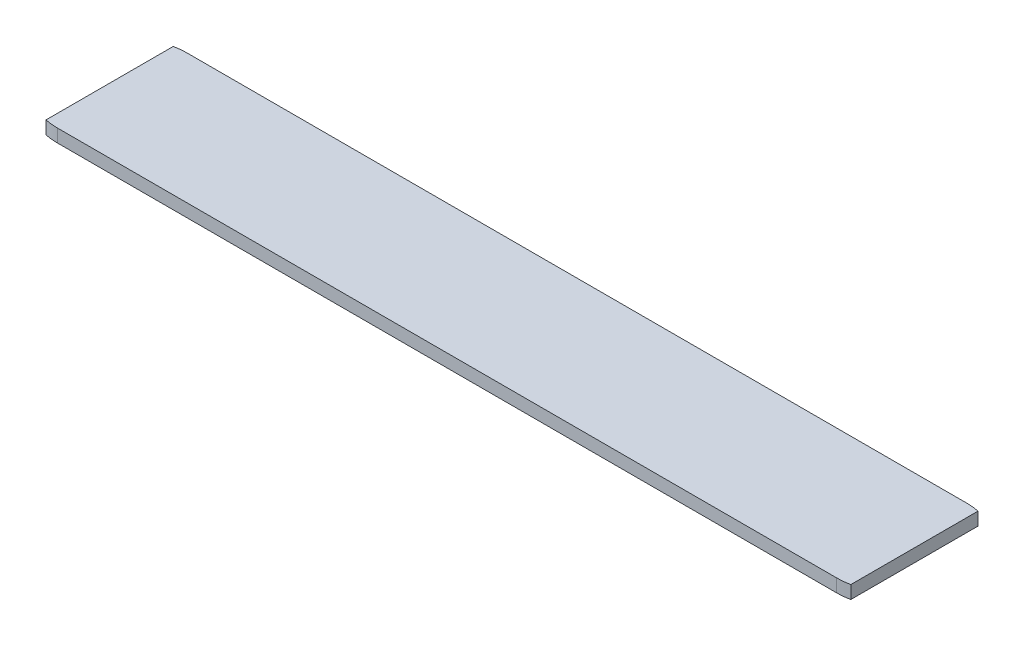
ISO-10303-21;
HEADER;
FILE_DESCRIPTION(('STEP AP214'),'2;1');
FILE_NAME('part.step','',(''),(''),'','','');
FILE_SCHEMA(('AUTOMOTIVE_DESIGN { 1 0 10303 214 1 1 1 1 }'));
ENDSEC;
DATA;
#1=APPLICATION_CONTEXT('core data for automotive mechanical design processes');
#2=APPLICATION_PROTOCOL_DEFINITION('international standard','automotive_design',2000,#1);
#3=PRODUCT_CONTEXT('',#1,'mechanical');
#4=PRODUCT('Part','Part','',(#3));
#5=PRODUCT_RELATED_PRODUCT_CATEGORY('part','',(#4));
#6=PRODUCT_DEFINITION_FORMATION('','',#4);
#7=PRODUCT_DEFINITION_CONTEXT('part definition',#1,'design');
#8=PRODUCT_DEFINITION('design','',#6,#7);
#9=PRODUCT_DEFINITION_SHAPE('','',#8);
#10=(LENGTH_UNIT() NAMED_UNIT(*) SI_UNIT(.MILLI.,.METRE.));
#11=(NAMED_UNIT(*) PLANE_ANGLE_UNIT() SI_UNIT($,.RADIAN.));
#12=(NAMED_UNIT(*) SI_UNIT($,.STERADIAN.) SOLID_ANGLE_UNIT());
#13=UNCERTAINTY_MEASURE_WITH_UNIT(LENGTH_MEASURE(1.E-05),#10,'distance_accuracy_value','');
#14=(GEOMETRIC_REPRESENTATION_CONTEXT(3) GLOBAL_UNCERTAINTY_ASSIGNED_CONTEXT((#13)) GLOBAL_UNIT_ASSIGNED_CONTEXT((#10,
#11,#12)) REPRESENTATION_CONTEXT('',''));
#15=CARTESIAN_POINT('',(0.,0.,0.));
#16=DIRECTION('',(0.,0.,1.));
#17=DIRECTION('',(1.,0.,0.));
#18=AXIS2_PLACEMENT_3D('',#15,#16,#17);
#19=CARTESIAN_POINT('',(-47.625,1.58750000000002,0.));
#20=DIRECTION('',(0.,-1.,0.));
#21=DIRECTION('',(0.,0.,-1.));
#22=AXIS2_PLACEMENT_3D('',#19,#20,#21);
#23=CYLINDRICAL_SURFACE('',#22,7.9375);
#24=DIRECTION('',(0.,-1.,0.));
#25=VECTOR('',#24,1.);
#26=CARTESIAN_POINT('',(-49.2125,1.58750000000002,-7.7771299333366));
#27=LINE('',#26,#25);
#28=CARTESIAN_POINT('',(-49.2125,1.58750000000002,-7.7771299333366));
#29=VERTEX_POINT('',#28);
#30=CARTESIAN_POINT('',(-49.2125,0.,-7.7771299333366));
#31=VERTEX_POINT('',#30);
#32=EDGE_CURVE('E61',#29,#31,#27,.T.);
#33=ORIENTED_EDGE('',*,*,#32,.F.);
#34=CARTESIAN_POINT('',(-47.625,1.58750000000002,0.));
#35=DIRECTION('',(0.,1.,0.));
#36=DIRECTION('',(0.,0.,1.));
#37=AXIS2_PLACEMENT_3D('',#34,#35,#36);
#38=CIRCLE('',#37,7.9375);
#39=CARTESIAN_POINT('',(-47.625,1.58750000000002,-7.93750000000001));
#40=VERTEX_POINT('',#39);
#41=EDGE_CURVE('E168',#40,#29,#38,.T.);
#42=ORIENTED_EDGE('',*,*,#41,.F.);
#43=DIRECTION('',(0.,-1.,0.));
#44=VECTOR('',#43,1.);
#45=CARTESIAN_POINT('',(-47.625,1.58750000000002,-7.93750000000001));
#46=LINE('',#45,#44);
#47=CARTESIAN_POINT('',(-47.625,0.,-7.93750000000001));
#48=VERTEX_POINT('',#47);
#49=EDGE_CURVE('E128',#40,#48,#46,.T.);
#50=ORIENTED_EDGE('',*,*,#49,.T.);
#51=CARTESIAN_POINT('',(-47.625,0.,0.));
#52=DIRECTION('',(0.,1.,0.));
#53=DIRECTION('',(0.,0.,1.));
#54=AXIS2_PLACEMENT_3D('',#51,#52,#53);
#55=CIRCLE('',#54,7.9375);
#56=EDGE_CURVE('E133',#48,#31,#55,.T.);
#57=ORIENTED_EDGE('',*,*,#56,.T.);
#58=EDGE_LOOP('',(#33,#42,#50,#57));
#59=FACE_BOUND('',#58,.T.);
#60=ADVANCED_FACE('F40',(#59),#23,.T.);
#61=DIRECTION('',(0.,-1.,0.));
#62=VECTOR('',#61,1.);
#63=CARTESIAN_POINT('',(-49.2125,1.58750000000002,7.7771299333366));
#64=LINE('',#63,#62);
#65=CARTESIAN_POINT('',(-49.2125,0.,7.7771299333366));
#66=VERTEX_POINT('',#65);
#67=CARTESIAN_POINT('',(-49.2125,1.58750000000002,7.7771299333366));
#68=VERTEX_POINT('',#67);
#69=EDGE_CURVE('E118',#66,#68,#64,.F.);
#70=ORIENTED_EDGE('',*,*,#69,.F.);
#71=CARTESIAN_POINT('',(-47.625,0.,7.93750000000001));
#72=VERTEX_POINT('',#71);
#73=EDGE_CURVE('E137',#66,#72,#55,.T.);
#74=ORIENTED_EDGE('',*,*,#73,.T.);
#75=DIRECTION('',(0.,-1.,0.));
#76=VECTOR('',#75,1.);
#77=CARTESIAN_POINT('',(-47.625,1.58750000000002,7.93750000000001));
#78=LINE('',#77,#76);
#79=CARTESIAN_POINT('',(-47.625,1.58750000000002,7.93750000000001));
#80=VERTEX_POINT('',#79);
#81=EDGE_CURVE('E151',#80,#72,#78,.T.);
#82=ORIENTED_EDGE('',*,*,#81,.F.);
#83=EDGE_CURVE('E143',#68,#80,#38,.T.);
#84=ORIENTED_EDGE('',*,*,#83,.F.);
#85=EDGE_LOOP('',(#70,#74,#82,#84));
#86=FACE_BOUND('',#85,.T.);
#87=ADVANCED_FACE('F177',(#86),#23,.T.);
#88=CARTESIAN_POINT('',(47.625,1.58750000000002,0.));
#89=DIRECTION('',(0.,-1.,0.));
#90=DIRECTION('',(0.,0.,-1.));
#91=AXIS2_PLACEMENT_3D('',#88,#89,#90);
#92=CYLINDRICAL_SURFACE('',#91,7.9375);
#93=DIRECTION('',(0.,-1.,0.));
#94=VECTOR('',#93,1.);
#95=CARTESIAN_POINT('',(49.2125,1.58750000000002,7.7771299333366));
#96=LINE('',#95,#94);
#97=CARTESIAN_POINT('',(49.2125,1.58750000000002,7.7771299333366));
#98=VERTEX_POINT('',#97);
#99=CARTESIAN_POINT('',(49.2125,0.,7.7771299333366));
#100=VERTEX_POINT('',#99);
#101=EDGE_CURVE('E54',#98,#100,#96,.T.);
#102=ORIENTED_EDGE('',*,*,#101,.F.);
#103=CARTESIAN_POINT('',(47.625,1.58750000000002,0.));
#104=DIRECTION('',(0.,1.,0.));
#105=DIRECTION('',(0.,0.,1.));
#106=AXIS2_PLACEMENT_3D('',#103,#104,#105);
#107=CIRCLE('',#106,7.9375);
#108=CARTESIAN_POINT('',(47.625,1.58750000000002,7.93750000000001));
#109=VERTEX_POINT('',#108);
#110=EDGE_CURVE('E115',#109,#98,#107,.T.);
#111=ORIENTED_EDGE('',*,*,#110,.F.);
#112=DIRECTION('',(0.,-1.,0.));
#113=VECTOR('',#112,1.);
#114=CARTESIAN_POINT('',(47.625,1.58750000000002,7.93750000000001));
#115=LINE('',#114,#113);
#116=CARTESIAN_POINT('',(47.625,0.,7.93750000000001));
#117=VERTEX_POINT('',#116);
#118=EDGE_CURVE('E149',#109,#117,#115,.T.);
#119=ORIENTED_EDGE('',*,*,#118,.T.);
#120=CARTESIAN_POINT('',(47.625,0.,0.));
#121=DIRECTION('',(0.,1.,0.));
#122=DIRECTION('',(0.,0.,1.));
#123=AXIS2_PLACEMENT_3D('',#120,#121,#122);
#124=CIRCLE('',#123,7.9375);
#125=EDGE_CURVE('E117',#117,#100,#124,.T.);
#126=ORIENTED_EDGE('',*,*,#125,.T.);
#127=EDGE_LOOP('',(#102,#111,#119,#126));
#128=FACE_BOUND('',#127,.T.);
#129=ADVANCED_FACE('F113',(#128),#92,.T.);
#130=DIRECTION('',(0.,-1.,0.));
#131=VECTOR('',#130,1.);
#132=CARTESIAN_POINT('',(49.2125,1.58750000000002,-7.7771299333366));
#133=LINE('',#132,#131);
#134=CARTESIAN_POINT('',(49.2125,0.,-7.7771299333366));
#135=VERTEX_POINT('',#134);
#136=CARTESIAN_POINT('',(49.2125,1.58750000000002,-7.7771299333366));
#137=VERTEX_POINT('',#136);
#138=EDGE_CURVE('E104',#135,#137,#133,.F.);
#139=ORIENTED_EDGE('',*,*,#138,.F.);
#140=CARTESIAN_POINT('',(47.625,0.,-7.93750000000001));
#141=VERTEX_POINT('',#140);
#142=EDGE_CURVE('E139',#135,#141,#124,.T.);
#143=ORIENTED_EDGE('',*,*,#142,.T.);
#144=DIRECTION('',(0.,-1.,0.));
#145=VECTOR('',#144,1.);
#146=CARTESIAN_POINT('',(47.625,1.58750000000002,-7.93750000000001));
#147=LINE('',#146,#145);
#148=CARTESIAN_POINT('',(47.625,1.58750000000002,-7.93750000000001));
#149=VERTEX_POINT('',#148);
#150=EDGE_CURVE('E146',#149,#141,#147,.T.);
#151=ORIENTED_EDGE('',*,*,#150,.F.);
#152=EDGE_CURVE('E126',#137,#149,#107,.T.);
#153=ORIENTED_EDGE('',*,*,#152,.F.);
#154=EDGE_LOOP('',(#139,#143,#151,#153));
#155=FACE_BOUND('',#154,.T.);
#156=ADVANCED_FACE('F156',(#155),#92,.T.);
#157=CARTESIAN_POINT('',(-47.625,1.58750000000002,0.));
#158=DIRECTION('',(0.,1.,0.));
#159=DIRECTION('',(0.,0.,1.));
#160=AXIS2_PLACEMENT_3D('',#157,#158,#159);
#161=PLANE('',#160);
#162=ORIENTED_EDGE('',*,*,#41,.T.);
#163=DIRECTION('',(0.,0.,1.));
#164=VECTOR('',#163,1.);
#165=CARTESIAN_POINT('',(-49.2125,1.58750000000002,-7.93749999999999));
#166=LINE('',#165,#164);
#167=EDGE_CURVE('E108',#29,#68,#166,.T.);
#168=ORIENTED_EDGE('',*,*,#167,.T.);
#169=ORIENTED_EDGE('',*,*,#83,.T.);
#170=DIRECTION('',(1.,0.,0.));
#171=VECTOR('',#170,1.);
#172=CARTESIAN_POINT('',(-47.625,1.58750000000002,7.93750000000001));
#173=LINE('',#172,#171);
#174=EDGE_CURVE('E123',#80,#109,#173,.T.);
#175=ORIENTED_EDGE('',*,*,#174,.T.);
#176=ORIENTED_EDGE('',*,*,#110,.T.);
#177=DIRECTION('',(0.,0.,-1.));
#178=VECTOR('',#177,1.);
#179=CARTESIAN_POINT('',(49.2125,1.58750000000002,-7.93749999999999));
#180=LINE('',#179,#178);
#181=EDGE_CURVE('E101',#98,#137,#180,.T.);
#182=ORIENTED_EDGE('',*,*,#181,.T.);
#183=ORIENTED_EDGE('',*,*,#152,.T.);
#184=DIRECTION('',(-1.,0.,0.));
#185=VECTOR('',#184,1.);
#186=CARTESIAN_POINT('',(-47.625,1.58750000000002,-7.93750000000001));
#187=LINE('',#186,#185);
#188=EDGE_CURVE('E125',#149,#40,#187,.T.);
#189=ORIENTED_EDGE('',*,*,#188,.T.);
#190=EDGE_LOOP('',(#162,#168,#169,#175,#176,#182,#183,#189));
#191=FACE_BOUND('',#190,.T.);
#192=ADVANCED_FACE('F121',(#191),#161,.T.);
#193=CARTESIAN_POINT('',(-47.625,0.,0.));
#194=DIRECTION('',(0.,1.,0.));
#195=DIRECTION('',(0.,0.,1.));
#196=AXIS2_PLACEMENT_3D('',#193,#194,#195);
#197=PLANE('',#196);
#198=DIRECTION('',(0.,0.,1.));
#199=VECTOR('',#198,1.);
#200=CARTESIAN_POINT('',(-49.2125,0.,0.));
#201=LINE('',#200,#199);
#202=EDGE_CURVE('E11',#31,#66,#201,.T.);
#203=ORIENTED_EDGE('',*,*,#202,.F.);
#204=ORIENTED_EDGE('',*,*,#56,.F.);
#205=DIRECTION('',(-1.,0.,0.));
#206=VECTOR('',#205,1.);
#207=CARTESIAN_POINT('',(-47.625,0.,-7.93750000000001));
#208=LINE('',#207,#206);
#209=EDGE_CURVE('E141',#141,#48,#208,.T.);
#210=ORIENTED_EDGE('',*,*,#209,.F.);
#211=ORIENTED_EDGE('',*,*,#142,.F.);
#212=DIRECTION('',(0.,0.,-1.));
#213=VECTOR('',#212,1.);
#214=CARTESIAN_POINT('',(49.2125,0.,0.));
#215=LINE('',#214,#213);
#216=EDGE_CURVE('E47',#100,#135,#215,.T.);
#217=ORIENTED_EDGE('',*,*,#216,.F.);
#218=ORIENTED_EDGE('',*,*,#125,.F.);
#219=DIRECTION('',(1.,0.,0.));
#220=VECTOR('',#219,1.);
#221=CARTESIAN_POINT('',(-47.625,0.,7.93750000000001));
#222=LINE('',#221,#220);
#223=EDGE_CURVE('E136',#72,#117,#222,.T.);
#224=ORIENTED_EDGE('',*,*,#223,.F.);
#225=ORIENTED_EDGE('',*,*,#73,.F.);
#226=EDGE_LOOP('',(#203,#204,#210,#211,#217,#218,#224,#225));
#227=FACE_BOUND('',#226,.T.);
#228=ADVANCED_FACE('F160',(#227),#197,.F.);
#229=CARTESIAN_POINT('',(-47.625,1.58750000000002,7.93750000000001));
#230=DIRECTION('',(0.,0.,-1.));
#231=DIRECTION('',(-1.,0.,0.));
#232=AXIS2_PLACEMENT_3D('',#229,#230,#231);
#233=PLANE('',#232);
#234=ORIENTED_EDGE('',*,*,#223,.T.);
#235=ORIENTED_EDGE('',*,*,#118,.F.);
#236=ORIENTED_EDGE('',*,*,#174,.F.);
#237=ORIENTED_EDGE('',*,*,#81,.T.);
#238=EDGE_LOOP('',(#234,#235,#236,#237));
#239=FACE_BOUND('',#238,.T.);
#240=ADVANCED_FACE('F181',(#239),#233,.F.);
#241=CARTESIAN_POINT('',(-47.625,1.58750000000002,-7.93750000000001));
#242=DIRECTION('',(0.,0.,1.));
#243=DIRECTION('',(1.,0.,0.));
#244=AXIS2_PLACEMENT_3D('',#241,#242,#243);
#245=PLANE('',#244);
#246=ORIENTED_EDGE('',*,*,#209,.T.);
#247=ORIENTED_EDGE('',*,*,#49,.F.);
#248=ORIENTED_EDGE('',*,*,#188,.F.);
#249=ORIENTED_EDGE('',*,*,#150,.T.);
#250=EDGE_LOOP('',(#246,#247,#248,#249));
#251=FACE_BOUND('',#250,.T.);
#252=ADVANCED_FACE('F164',(#251),#245,.F.);
#253=CARTESIAN_POINT('',(49.2125,-0.952499999999995,-7.93749999999999));
#254=DIRECTION('',(1.,0.,0.));
#255=DIRECTION('',(0.,0.,-1.));
#256=AXIS2_PLACEMENT_3D('',#253,#254,#255);
#257=PLANE('',#256);
#258=ORIENTED_EDGE('',*,*,#101,.T.);
#259=ORIENTED_EDGE('',*,*,#216,.T.);
#260=ORIENTED_EDGE('',*,*,#138,.T.);
#261=ORIENTED_EDGE('',*,*,#181,.F.);
#262=EDGE_LOOP('',(#258,#259,#260,#261));
#263=FACE_BOUND('',#262,.T.);
#264=ADVANCED_FACE('F102',(#263),#257,.T.);
#265=CARTESIAN_POINT('',(-49.2125,-0.952499999999995,-7.93749999999999));
#266=DIRECTION('',(-1.,0.,0.));
#267=DIRECTION('',(0.,0.,1.));
#268=AXIS2_PLACEMENT_3D('',#265,#266,#267);
#269=PLANE('',#268);
#270=ORIENTED_EDGE('',*,*,#32,.T.);
#271=ORIENTED_EDGE('',*,*,#202,.T.);
#272=ORIENTED_EDGE('',*,*,#69,.T.);
#273=ORIENTED_EDGE('',*,*,#167,.F.);
#274=EDGE_LOOP('',(#270,#271,#272,#273));
#275=FACE_BOUND('',#274,.T.);
#276=ADVANCED_FACE('F182',(#275),#269,.T.);
#277=CLOSED_SHELL('',(#60,#87,#129,#156,#192,#228,#240,#252,#264,#276));
#278=MANIFOLD_SOLID_BREP('B2',#277);
#279=ADVANCED_BREP_SHAPE_REPRESENTATION('',(#18,#278),#14);
#280=SHAPE_DEFINITION_REPRESENTATION(#9,#279);
ENDSEC;
END-ISO-10303-21;
